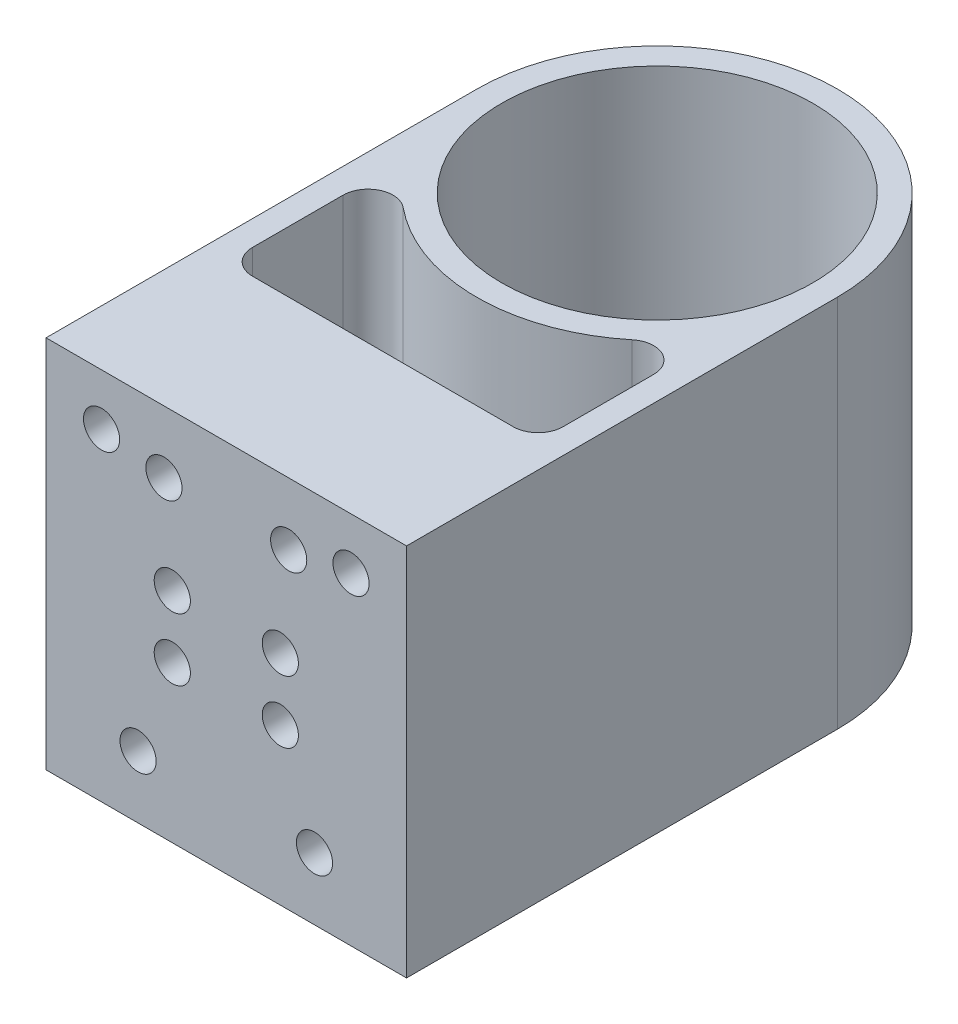
ISO-10303-21;
HEADER;
FILE_DESCRIPTION(('STEP AP214'),'2;1');
FILE_NAME('part.step','',(''),(''),'','','');
FILE_SCHEMA(('AUTOMOTIVE_DESIGN { 1 0 10303 214 1 1 1 1 }'));
ENDSEC;
DATA;
#1=APPLICATION_CONTEXT('core data for automotive mechanical design processes');
#2=APPLICATION_PROTOCOL_DEFINITION('international standard','automotive_design',2000,#1);
#3=PRODUCT_CONTEXT('',#1,'mechanical');
#4=PRODUCT('Part','Part','',(#3));
#5=PRODUCT_RELATED_PRODUCT_CATEGORY('part','',(#4));
#6=PRODUCT_DEFINITION_FORMATION('','',#4);
#7=PRODUCT_DEFINITION_CONTEXT('part definition',#1,'design');
#8=PRODUCT_DEFINITION('design','',#6,#7);
#9=PRODUCT_DEFINITION_SHAPE('','',#8);
#10=(LENGTH_UNIT() NAMED_UNIT(*) SI_UNIT(.MILLI.,.METRE.));
#11=(NAMED_UNIT(*) PLANE_ANGLE_UNIT() SI_UNIT($,.RADIAN.));
#12=(NAMED_UNIT(*) SI_UNIT($,.STERADIAN.) SOLID_ANGLE_UNIT());
#13=UNCERTAINTY_MEASURE_WITH_UNIT(LENGTH_MEASURE(1.E-05),#10,'distance_accuracy_value','');
#14=(GEOMETRIC_REPRESENTATION_CONTEXT(3) GLOBAL_UNCERTAINTY_ASSIGNED_CONTEXT((#13)) GLOBAL_UNIT_ASSIGNED_CONTEXT((#10,
#11,#12)) REPRESENTATION_CONTEXT('',''));
#15=CARTESIAN_POINT('',(0.,0.,0.));
#16=DIRECTION('',(0.,0.,1.));
#17=DIRECTION('',(1.,0.,0.));
#18=AXIS2_PLACEMENT_3D('',#15,#16,#17);
#19=CARTESIAN_POINT('',(0.,30.,0.));
#20=DIRECTION('',(0.,-1.,0.));
#21=DIRECTION('',(0.,0.,-1.));
#22=AXIS2_PLACEMENT_3D('',#19,#20,#21);
#23=CYLINDRICAL_SURFACE('',#22,14.45);
#24=DIRECTION('',(0.,-1.,0.));
#25=VECTOR('',#24,1.);
#26=CARTESIAN_POINT('',(-14.45,30.,0.));
#27=LINE('',#26,#25);
#28=CARTESIAN_POINT('',(-14.45,30.,0.));
#29=VERTEX_POINT('',#28);
#30=CARTESIAN_POINT('',(-14.45,0.,0.));
#31=VERTEX_POINT('',#30);
#32=EDGE_CURVE('E320',#29,#31,#27,.T.);
#33=ORIENTED_EDGE('',*,*,#32,.F.);
#34=CARTESIAN_POINT('',(0.,30.,0.));
#35=DIRECTION('',(0.,1.,0.));
#36=DIRECTION('',(0.,0.,1.));
#37=AXIS2_PLACEMENT_3D('',#34,#35,#36);
#38=CIRCLE('',#37,14.45);
#39=CARTESIAN_POINT('',(14.45,30.,0.));
#40=VERTEX_POINT('',#39);
#41=EDGE_CURVE('E330',#40,#29,#38,.T.);
#42=ORIENTED_EDGE('',*,*,#41,.F.);
#43=DIRECTION('',(0.,-1.,0.));
#44=VECTOR('',#43,1.);
#45=CARTESIAN_POINT('',(14.45,30.,0.));
#46=LINE('',#45,#44);
#47=CARTESIAN_POINT('',(14.45,0.,0.));
#48=VERTEX_POINT('',#47);
#49=EDGE_CURVE('E326',#40,#48,#46,.T.);
#50=ORIENTED_EDGE('',*,*,#49,.T.);
#51=CARTESIAN_POINT('',(0.,0.,0.));
#52=DIRECTION('',(0.,1.,0.));
#53=DIRECTION('',(0.,0.,1.));
#54=AXIS2_PLACEMENT_3D('',#51,#52,#53);
#55=CIRCLE('',#54,14.45);
#56=EDGE_CURVE('E329',#48,#31,#55,.T.);
#57=ORIENTED_EDGE('',*,*,#56,.T.);
#58=EDGE_LOOP('',(#33,#42,#50,#57));
#59=FACE_BOUND('',#58,.T.);
#60=ADVANCED_FACE('F39',(#59),#23,.T.);
#61=CARTESIAN_POINT('',(0.,30.,0.));
#62=DIRECTION('',(0.,1.,0.));
#63=DIRECTION('',(0.,0.,1.));
#64=AXIS2_PLACEMENT_3D('',#61,#62,#63);
#65=PLANE('',#64);
#66=CARTESIAN_POINT('',(-10.45,30.,20.));
#67=DIRECTION('',(0.,1.,0.));
#68=DIRECTION('',(0.,0.,-1.));
#69=AXIS2_PLACEMENT_3D('',#66,#67,#68);
#70=CIRCLE('',#69,2.);
#71=CARTESIAN_POINT('',(-12.45,30.,20.));
#72=VERTEX_POINT('',#71);
#73=CARTESIAN_POINT('',(-10.45,30.,22.));
#74=VERTEX_POINT('',#73);
#75=EDGE_CURVE('E59',#72,#74,#70,.T.);
#76=ORIENTED_EDGE('',*,*,#75,.F.);
#77=DIRECTION('',(0.,0.,1.));
#78=VECTOR('',#77,1.);
#79=CARTESIAN_POINT('',(-12.45,30.,12.7366842231407));
#80=LINE('',#79,#78);
#81=CARTESIAN_POINT('',(-12.45,30.,12.7366842231407));
#82=VERTEX_POINT('',#81);
#83=EDGE_CURVE('E170',#82,#72,#80,.T.);
#84=ORIENTED_EDGE('',*,*,#83,.F.);
#85=CARTESIAN_POINT('',(-10.45,30.,12.7366842231407));
#86=DIRECTION('',(0.,1.,0.));
#87=DIRECTION('',(0.,0.,1.));
#88=AXIS2_PLACEMENT_3D('',#85,#86,#87);
#89=CIRCLE('',#88,2.);
#90=CARTESIAN_POINT('',(-9.18141122913506,30.,11.1905010094058));
#91=VERTEX_POINT('',#90);
#92=EDGE_CURVE('E173',#91,#82,#89,.T.);
#93=ORIENTED_EDGE('',*,*,#92,.F.);
#94=CARTESIAN_POINT('',(0.,30.,0.));
#95=DIRECTION('',(0.,-1.,0.));
#96=DIRECTION('',(0.,0.,1.));
#97=AXIS2_PLACEMENT_3D('',#94,#95,#96);
#98=CIRCLE('',#97,14.475);
#99=CARTESIAN_POINT('',(9.18141122913505,30.,11.1905010094058));
#100=VERTEX_POINT('',#99);
#101=EDGE_CURVE('E202',#100,#91,#98,.T.);
#102=ORIENTED_EDGE('',*,*,#101,.F.);
#103=CARTESIAN_POINT('',(10.45,30.,12.7366842231407));
#104=DIRECTION('',(0.,1.,0.));
#105=DIRECTION('',(0.,0.,-1.));
#106=AXIS2_PLACEMENT_3D('',#103,#104,#105);
#107=CIRCLE('',#106,2.);
#108=CARTESIAN_POINT('',(12.45,30.,12.7366842231407));
#109=VERTEX_POINT('',#108);
#110=EDGE_CURVE('E199',#109,#100,#107,.T.);
#111=ORIENTED_EDGE('',*,*,#110,.F.);
#112=DIRECTION('',(0.,0.,-1.));
#113=VECTOR('',#112,1.);
#114=CARTESIAN_POINT('',(12.45,30.,20.));
#115=LINE('',#114,#113);
#116=CARTESIAN_POINT('',(12.45,30.,20.));
#117=VERTEX_POINT('',#116);
#118=EDGE_CURVE('E196',#117,#109,#115,.T.);
#119=ORIENTED_EDGE('',*,*,#118,.F.);
#120=CARTESIAN_POINT('',(10.45,30.,20.));
#121=DIRECTION('',(0.,1.,0.));
#122=DIRECTION('',(0.,0.,1.));
#123=AXIS2_PLACEMENT_3D('',#120,#121,#122);
#124=CIRCLE('',#123,2.);
#125=CARTESIAN_POINT('',(10.45,30.,22.));
#126=VERTEX_POINT('',#125);
#127=EDGE_CURVE('E193',#126,#117,#124,.T.);
#128=ORIENTED_EDGE('',*,*,#127,.F.);
#129=DIRECTION('',(1.,0.,0.));
#130=VECTOR('',#129,1.);
#131=CARTESIAN_POINT('',(-10.45,30.,22.));
#132=LINE('',#131,#130);
#133=EDGE_CURVE('E190',#74,#126,#132,.T.);
#134=ORIENTED_EDGE('',*,*,#133,.F.);
#135=EDGE_LOOP('',(#76,#84,#93,#102,#111,#119,#128,#134));
#136=FACE_BOUND('',#135,.T.);
#137=CARTESIAN_POINT('',(0.,30.,0.));
#138=DIRECTION('',(0.,1.,0.));
#139=DIRECTION('',(0.,0.,1.));
#140=AXIS2_PLACEMENT_3D('',#137,#138,#139);
#141=CIRCLE('',#140,12.475);
#142=CARTESIAN_POINT('',(0.,30.,12.475));
#143=VERTEX_POINT('',#142);
#144=EDGE_CURVE('E307',#143,#143,#141,.T.);
#145=ORIENTED_EDGE('',*,*,#144,.F.);
#146=EDGE_LOOP('',(#145));
#147=FACE_BOUND('',#146,.T.);
#148=ORIENTED_EDGE('',*,*,#41,.T.);
#149=DIRECTION('',(0.,0.,1.));
#150=VECTOR('',#149,1.);
#151=CARTESIAN_POINT('',(-14.45,30.,0.));
#152=LINE('',#151,#150);
#153=CARTESIAN_POINT('',(-14.45,30.,34.55));
#154=VERTEX_POINT('',#153);
#155=EDGE_CURVE('E314',#29,#154,#152,.T.);
#156=ORIENTED_EDGE('',*,*,#155,.T.);
#157=DIRECTION('',(-1.,0.,0.));
#158=VECTOR('',#157,1.);
#159=CARTESIAN_POINT('',(14.45,30.,34.55));
#160=LINE('',#159,#158);
#161=CARTESIAN_POINT('',(14.45,30.,34.55));
#162=VERTEX_POINT('',#161);
#163=EDGE_CURVE('E286',#162,#154,#160,.T.);
#164=ORIENTED_EDGE('',*,*,#163,.F.);
#165=DIRECTION('',(0.,0.,-1.));
#166=VECTOR('',#165,1.);
#167=CARTESIAN_POINT('',(14.45,30.,0.));
#168=LINE('',#167,#166);
#169=EDGE_CURVE('E316',#162,#40,#168,.T.);
#170=ORIENTED_EDGE('',*,*,#169,.T.);
#171=EDGE_LOOP('',(#148,#156,#164,#170));
#172=FACE_BOUND('',#171,.T.);
#173=ADVANCED_FACE('F383',(#136,#147,#172),#65,.T.);
#174=CARTESIAN_POINT('',(0.,0.,0.));
#175=DIRECTION('',(0.,1.,0.));
#176=DIRECTION('',(0.,0.,1.));
#177=AXIS2_PLACEMENT_3D('',#174,#175,#176);
#178=PLANE('',#177);
#179=DIRECTION('',(0.,0.,1.));
#180=VECTOR('',#179,1.);
#181=CARTESIAN_POINT('',(-12.45,0.,12.7366842231407));
#182=LINE('',#181,#180);
#183=CARTESIAN_POINT('',(-12.45,0.,12.7366842231407));
#184=VERTEX_POINT('',#183);
#185=CARTESIAN_POINT('',(-12.45,0.,20.));
#186=VERTEX_POINT('',#185);
#187=EDGE_CURVE('E169',#184,#186,#182,.T.);
#188=ORIENTED_EDGE('',*,*,#187,.T.);
#189=CARTESIAN_POINT('',(-10.45,0.,20.));
#190=DIRECTION('',(0.,1.,0.));
#191=DIRECTION('',(0.,0.,-1.));
#192=AXIS2_PLACEMENT_3D('',#189,#190,#191);
#193=CIRCLE('',#192,2.);
#194=CARTESIAN_POINT('',(-10.45,0.,22.));
#195=VERTEX_POINT('',#194);
#196=EDGE_CURVE('E150',#186,#195,#193,.T.);
#197=ORIENTED_EDGE('',*,*,#196,.T.);
#198=DIRECTION('',(1.,0.,0.));
#199=VECTOR('',#198,1.);
#200=CARTESIAN_POINT('',(-10.45,0.,22.));
#201=LINE('',#200,#199);
#202=CARTESIAN_POINT('',(10.45,0.,22.));
#203=VERTEX_POINT('',#202);
#204=EDGE_CURVE('E159',#195,#203,#201,.T.);
#205=ORIENTED_EDGE('',*,*,#204,.T.);
#206=CARTESIAN_POINT('',(10.45,0.,20.));
#207=DIRECTION('',(0.,1.,0.));
#208=DIRECTION('',(0.,0.,1.));
#209=AXIS2_PLACEMENT_3D('',#206,#207,#208);
#210=CIRCLE('',#209,2.);
#211=CARTESIAN_POINT('',(12.45,0.,20.));
#212=VERTEX_POINT('',#211);
#213=EDGE_CURVE('E67',#203,#212,#210,.T.);
#214=ORIENTED_EDGE('',*,*,#213,.T.);
#215=DIRECTION('',(0.,0.,-1.));
#216=VECTOR('',#215,1.);
#217=CARTESIAN_POINT('',(12.45,0.,20.));
#218=LINE('',#217,#216);
#219=CARTESIAN_POINT('',(12.45,0.,12.7366842231407));
#220=VERTEX_POINT('',#219);
#221=EDGE_CURVE('E177',#212,#220,#218,.T.);
#222=ORIENTED_EDGE('',*,*,#221,.T.);
#223=CARTESIAN_POINT('',(10.45,0.,12.7366842231407));
#224=DIRECTION('',(0.,1.,0.));
#225=DIRECTION('',(0.,0.,-1.));
#226=AXIS2_PLACEMENT_3D('',#223,#224,#225);
#227=CIRCLE('',#226,2.);
#228=CARTESIAN_POINT('',(9.18141122913505,0.,11.1905010094058));
#229=VERTEX_POINT('',#228);
#230=EDGE_CURVE('E180',#220,#229,#227,.T.);
#231=ORIENTED_EDGE('',*,*,#230,.T.);
#232=CARTESIAN_POINT('',(0.,0.,0.));
#233=DIRECTION('',(0.,-1.,0.));
#234=DIRECTION('',(0.,0.,1.));
#235=AXIS2_PLACEMENT_3D('',#232,#233,#234);
#236=CIRCLE('',#235,14.475);
#237=CARTESIAN_POINT('',(-9.18141122913506,0.,11.1905010094058));
#238=VERTEX_POINT('',#237);
#239=EDGE_CURVE('E183',#229,#238,#236,.T.);
#240=ORIENTED_EDGE('',*,*,#239,.T.);
#241=CARTESIAN_POINT('',(-10.45,0.,12.7366842231407));
#242=DIRECTION('',(0.,1.,0.));
#243=DIRECTION('',(0.,0.,1.));
#244=AXIS2_PLACEMENT_3D('',#241,#242,#243);
#245=CIRCLE('',#244,2.);
#246=EDGE_CURVE('E186',#238,#184,#245,.T.);
#247=ORIENTED_EDGE('',*,*,#246,.T.);
#248=EDGE_LOOP('',(#188,#197,#205,#214,#222,#231,#240,#247));
#249=FACE_BOUND('',#248,.T.);
#250=CARTESIAN_POINT('',(0.,0.,0.));
#251=DIRECTION('',(0.,-1.,0.));
#252=DIRECTION('',(0.,0.,-1.));
#253=AXIS2_PLACEMENT_3D('',#250,#251,#252);
#254=CIRCLE('',#253,3.65);
#255=CARTESIAN_POINT('',(0.,0.,-3.65));
#256=VERTEX_POINT('',#255);
#257=EDGE_CURVE('E289',#256,#256,#254,.T.);
#258=ORIENTED_EDGE('',*,*,#257,.F.);
#259=EDGE_LOOP('',(#258));
#260=FACE_BOUND('',#259,.T.);
#261=CARTESIAN_POINT('',(8.65,0.,0.));
#262=DIRECTION('',(0.,1.,0.));
#263=DIRECTION('',(0.,0.,1.));
#264=AXIS2_PLACEMENT_3D('',#261,#262,#263);
#265=CIRCLE('',#264,1.5);
#266=CARTESIAN_POINT('',(8.65,0.,1.5));
#267=VERTEX_POINT('',#266);
#268=EDGE_CURVE('E304',#267,#267,#265,.T.);
#269=ORIENTED_EDGE('',*,*,#268,.T.);
#270=EDGE_LOOP('',(#269));
#271=FACE_BOUND('',#270,.T.);
#272=CARTESIAN_POINT('',(-8.65,0.,0.));
#273=DIRECTION('',(0.,1.,0.));
#274=DIRECTION('',(0.,0.,1.));
#275=AXIS2_PLACEMENT_3D('',#272,#273,#274);
#276=CIRCLE('',#275,1.5);
#277=CARTESIAN_POINT('',(-8.65,0.,1.5));
#278=VERTEX_POINT('',#277);
#279=EDGE_CURVE('E299',#278,#278,#276,.T.);
#280=ORIENTED_EDGE('',*,*,#279,.T.);
#281=EDGE_LOOP('',(#280));
#282=FACE_BOUND('',#281,.T.);
#283=ORIENTED_EDGE('',*,*,#56,.F.);
#284=DIRECTION('',(0.,0.,-1.));
#285=VECTOR('',#284,1.);
#286=CARTESIAN_POINT('',(14.45,0.,0.));
#287=LINE('',#286,#285);
#288=CARTESIAN_POINT('',(14.45,0.,34.55));
#289=VERTEX_POINT('',#288);
#290=EDGE_CURVE('E317',#289,#48,#287,.T.);
#291=ORIENTED_EDGE('',*,*,#290,.F.);
#292=DIRECTION('',(1.,0.,0.));
#293=VECTOR('',#292,1.);
#294=CARTESIAN_POINT('',(-14.45,0.,34.55));
#295=LINE('',#294,#293);
#296=CARTESIAN_POINT('',(-14.45,0.,34.55));
#297=VERTEX_POINT('',#296);
#298=EDGE_CURVE('E280',#297,#289,#295,.T.);
#299=ORIENTED_EDGE('',*,*,#298,.F.);
#300=DIRECTION('',(0.,0.,1.));
#301=VECTOR('',#300,1.);
#302=CARTESIAN_POINT('',(-14.45,0.,0.));
#303=LINE('',#302,#301);
#304=EDGE_CURVE('E311',#31,#297,#303,.T.);
#305=ORIENTED_EDGE('',*,*,#304,.F.);
#306=EDGE_LOOP('',(#283,#291,#299,#305));
#307=FACE_BOUND('',#306,.T.);
#308=ADVANCED_FACE('F165',(#249,#260,#271,#282,#307),#178,.F.);
#309=CARTESIAN_POINT('',(-14.45,30.,0.));
#310=DIRECTION('',(1.,0.,0.));
#311=DIRECTION('',(0.,0.,-1.));
#312=AXIS2_PLACEMENT_3D('',#309,#310,#311);
#313=PLANE('',#312);
#314=ORIENTED_EDGE('',*,*,#304,.T.);
#315=DIRECTION('',(0.,-1.,0.));
#316=VECTOR('',#315,1.);
#317=CARTESIAN_POINT('',(-14.45,30.,34.55));
#318=LINE('',#317,#316);
#319=EDGE_CURVE('E277',#154,#297,#318,.T.);
#320=ORIENTED_EDGE('',*,*,#319,.F.);
#321=ORIENTED_EDGE('',*,*,#155,.F.);
#322=ORIENTED_EDGE('',*,*,#32,.T.);
#323=EDGE_LOOP('',(#314,#320,#321,#322));
#324=FACE_BOUND('',#323,.T.);
#325=ADVANCED_FACE('F398',(#324),#313,.F.);
#326=CARTESIAN_POINT('',(14.45,30.,0.));
#327=DIRECTION('',(-1.,0.,0.));
#328=DIRECTION('',(0.,0.,1.));
#329=AXIS2_PLACEMENT_3D('',#326,#327,#328);
#330=PLANE('',#329);
#331=ORIENTED_EDGE('',*,*,#290,.T.);
#332=ORIENTED_EDGE('',*,*,#49,.F.);
#333=ORIENTED_EDGE('',*,*,#169,.F.);
#334=DIRECTION('',(0.,1.,0.));
#335=VECTOR('',#334,1.);
#336=CARTESIAN_POINT('',(14.45,0.,34.55));
#337=LINE('',#336,#335);
#338=EDGE_CURVE('E283',#289,#162,#337,.T.);
#339=ORIENTED_EDGE('',*,*,#338,.F.);
#340=EDGE_LOOP('',(#331,#332,#333,#339));
#341=FACE_BOUND('',#340,.T.);
#342=ADVANCED_FACE('F404',(#341),#330,.F.);
#343=CARTESIAN_POINT('',(0.,2.,0.));
#344=DIRECTION('',(0.,1.,0.));
#345=DIRECTION('',(0.,0.,1.));
#346=AXIS2_PLACEMENT_3D('',#343,#344,#345);
#347=CYLINDRICAL_SURFACE('',#346,12.475);
#348=CARTESIAN_POINT('',(0.,2.,0.));
#349=DIRECTION('',(0.,1.,0.));
#350=DIRECTION('',(0.,0.,1.));
#351=AXIS2_PLACEMENT_3D('',#348,#349,#350);
#352=CIRCLE('',#351,12.475);
#353=CARTESIAN_POINT('',(0.,2.,12.475));
#354=VERTEX_POINT('',#353);
#355=EDGE_CURVE('E308',#354,#354,#352,.T.);
#356=ORIENTED_EDGE('',*,*,#355,.F.);
#357=EDGE_LOOP('',(#356));
#358=FACE_BOUND('',#357,.T.);
#359=ORIENTED_EDGE('',*,*,#144,.T.);
#360=EDGE_LOOP('',(#359));
#361=FACE_BOUND('',#360,.T.);
#362=ADVANCED_FACE('F415',(#358,#361),#347,.F.);
#363=CARTESIAN_POINT('',(0.,2.,0.));
#364=DIRECTION('',(0.,1.,0.));
#365=DIRECTION('',(0.,0.,1.));
#366=AXIS2_PLACEMENT_3D('',#363,#364,#365);
#367=PLANE('',#366);
#368=CARTESIAN_POINT('',(0.,2.,0.));
#369=DIRECTION('',(0.,-1.,0.));
#370=DIRECTION('',(0.,0.,-1.));
#371=AXIS2_PLACEMENT_3D('',#368,#369,#370);
#372=CIRCLE('',#371,3.65);
#373=CARTESIAN_POINT('',(0.,2.,-3.65));
#374=VERTEX_POINT('',#373);
#375=EDGE_CURVE('E290',#374,#374,#372,.T.);
#376=ORIENTED_EDGE('',*,*,#375,.T.);
#377=EDGE_LOOP('',(#376));
#378=FACE_BOUND('',#377,.T.);
#379=CARTESIAN_POINT('',(8.65,2.,0.));
#380=DIRECTION('',(0.,1.,0.));
#381=DIRECTION('',(0.,0.,1.));
#382=AXIS2_PLACEMENT_3D('',#379,#380,#381);
#383=CIRCLE('',#382,1.5);
#384=CARTESIAN_POINT('',(8.65,2.,1.5));
#385=VERTEX_POINT('',#384);
#386=EDGE_CURVE('E296',#385,#385,#383,.T.);
#387=ORIENTED_EDGE('',*,*,#386,.F.);
#388=EDGE_LOOP('',(#387));
#389=FACE_BOUND('',#388,.T.);
#390=CARTESIAN_POINT('',(-8.65,2.,0.));
#391=DIRECTION('',(0.,1.,0.));
#392=DIRECTION('',(0.,0.,-1.));
#393=AXIS2_PLACEMENT_3D('',#390,#391,#392);
#394=CIRCLE('',#393,1.5);
#395=CARTESIAN_POINT('',(-8.65,2.,-1.5));
#396=VERTEX_POINT('',#395);
#397=EDGE_CURVE('E293',#396,#396,#394,.T.);
#398=ORIENTED_EDGE('',*,*,#397,.F.);
#399=EDGE_LOOP('',(#398));
#400=FACE_BOUND('',#399,.T.);
#401=ORIENTED_EDGE('',*,*,#355,.T.);
#402=EDGE_LOOP('',(#401));
#403=FACE_BOUND('',#402,.T.);
#404=ADVANCED_FACE('F417',(#378,#389,#400,#403),#367,.T.);
#405=CARTESIAN_POINT('',(-8.65,-26.,0.));
#406=DIRECTION('',(0.,1.,0.));
#407=DIRECTION('',(0.,0.,1.));
#408=AXIS2_PLACEMENT_3D('',#405,#406,#407);
#409=CYLINDRICAL_SURFACE('',#408,1.5);
#410=ORIENTED_EDGE('',*,*,#397,.T.);
#411=EDGE_LOOP('',(#410));
#412=FACE_BOUND('',#411,.T.);
#413=ORIENTED_EDGE('',*,*,#279,.F.);
#414=EDGE_LOOP('',(#413));
#415=FACE_BOUND('',#414,.T.);
#416=ADVANCED_FACE('F421',(#412,#415),#409,.F.);
#417=CARTESIAN_POINT('',(8.65,-26.,0.));
#418=DIRECTION('',(0.,1.,0.));
#419=DIRECTION('',(0.,0.,1.));
#420=AXIS2_PLACEMENT_3D('',#417,#418,#419);
#421=CYLINDRICAL_SURFACE('',#420,1.5);
#422=ORIENTED_EDGE('',*,*,#386,.T.);
#423=EDGE_LOOP('',(#422));
#424=FACE_BOUND('',#423,.T.);
#425=ORIENTED_EDGE('',*,*,#268,.F.);
#426=EDGE_LOOP('',(#425));
#427=FACE_BOUND('',#426,.T.);
#428=ADVANCED_FACE('F358',(#424,#427),#421,.F.);
#429=CARTESIAN_POINT('',(0.,2.,0.));
#430=DIRECTION('',(0.,-1.,0.));
#431=DIRECTION('',(0.,0.,-1.));
#432=AXIS2_PLACEMENT_3D('',#429,#430,#431);
#433=CYLINDRICAL_SURFACE('',#432,3.65);
#434=ORIENTED_EDGE('',*,*,#375,.F.);
#435=EDGE_LOOP('',(#434));
#436=FACE_BOUND('',#435,.T.);
#437=ORIENTED_EDGE('',*,*,#257,.T.);
#438=EDGE_LOOP('',(#437));
#439=FACE_BOUND('',#438,.T.);
#440=ADVANCED_FACE('F354',(#436,#439),#433,.F.);
#441=CARTESIAN_POINT('',(0.,0.,34.55));
#442=DIRECTION('',(0.,0.,1.));
#443=DIRECTION('',(1.,0.,0.));
#444=AXIS2_PLACEMENT_3D('',#441,#442,#443);
#445=PLANE('',#444);
#446=CARTESIAN_POINT('',(-4.33012701892217,12.5,34.55));
#447=DIRECTION('',(0.,0.,1.));
#448=DIRECTION('',(1.,0.,0.));
#449=AXIS2_PLACEMENT_3D('',#446,#447,#448);
#450=CIRCLE('',#449,1.45);
#451=CARTESIAN_POINT('',(-2.88012701892217,12.5,34.55));
#452=VERTEX_POINT('',#451);
#453=EDGE_CURVE('E250',#452,#452,#450,.T.);
#454=ORIENTED_EDGE('',*,*,#453,.F.);
#455=EDGE_LOOP('',(#454));
#456=FACE_BOUND('',#455,.T.);
#457=CARTESIAN_POINT('',(-5.,25.,34.55));
#458=DIRECTION('',(0.,0.,1.));
#459=DIRECTION('',(1.,0.,0.));
#460=AXIS2_PLACEMENT_3D('',#457,#458,#459);
#461=CIRCLE('',#460,1.45);
#462=CARTESIAN_POINT('',(-3.55,25.,34.55));
#463=VERTEX_POINT('',#462);
#464=EDGE_CURVE('E256',#463,#463,#461,.T.);
#465=ORIENTED_EDGE('',*,*,#464,.F.);
#466=EDGE_LOOP('',(#465));
#467=FACE_BOUND('',#466,.T.);
#468=CARTESIAN_POINT('',(-10.,25.88,34.55));
#469=DIRECTION('',(0.,0.,1.));
#470=DIRECTION('',(1.,0.,0.));
#471=AXIS2_PLACEMENT_3D('',#468,#469,#470);
#472=CIRCLE('',#471,1.45);
#473=CARTESIAN_POINT('',(-8.55,25.88,34.55));
#474=VERTEX_POINT('',#473);
#475=EDGE_CURVE('E262',#474,#474,#472,.T.);
#476=ORIENTED_EDGE('',*,*,#475,.F.);
#477=EDGE_LOOP('',(#476));
#478=FACE_BOUND('',#477,.T.);
#479=CARTESIAN_POINT('',(-4.33012701892219,17.5,34.55));
#480=DIRECTION('',(0.,0.,1.));
#481=DIRECTION('',(1.,0.,0.));
#482=AXIS2_PLACEMENT_3D('',#479,#480,#481);
#483=CIRCLE('',#482,1.45);
#484=CARTESIAN_POINT('',(-2.88012701892219,17.5,34.55));
#485=VERTEX_POINT('',#484);
#486=EDGE_CURVE('E268',#485,#485,#483,.T.);
#487=ORIENTED_EDGE('',*,*,#486,.F.);
#488=EDGE_LOOP('',(#487));
#489=FACE_BOUND('',#488,.T.);
#490=CARTESIAN_POINT('',(-7.0711,5.,34.55));
#491=DIRECTION('',(0.,0.,1.));
#492=DIRECTION('',(1.,0.,0.));
#493=AXIS2_PLACEMENT_3D('',#490,#491,#492);
#494=CIRCLE('',#493,1.45);
#495=CARTESIAN_POINT('',(-5.6211,5.,34.55));
#496=VERTEX_POINT('',#495);
#497=EDGE_CURVE('E274',#496,#496,#494,.T.);
#498=ORIENTED_EDGE('',*,*,#497,.F.);
#499=EDGE_LOOP('',(#498));
#500=FACE_BOUND('',#499,.T.);
#501=ORIENTED_EDGE('',*,*,#319,.T.);
#502=ORIENTED_EDGE('',*,*,#298,.T.);
#503=ORIENTED_EDGE('',*,*,#338,.T.);
#504=ORIENTED_EDGE('',*,*,#163,.T.);
#505=EDGE_LOOP('',(#501,#502,#503,#504));
#506=FACE_BOUND('',#505,.T.);
#507=CARTESIAN_POINT('',(7.0711,5.,34.55));
#508=DIRECTION('',(0.,0.,1.));
#509=DIRECTION('',(1.,0.,0.));
#510=AXIS2_PLACEMENT_3D('',#507,#508,#509);
#511=CIRCLE('',#510,1.45);
#512=CARTESIAN_POINT('',(8.5211,5.,34.55));
#513=VERTEX_POINT('',#512);
#514=EDGE_CURVE('E271',#513,#513,#511,.T.);
#515=ORIENTED_EDGE('',*,*,#514,.F.);
#516=EDGE_LOOP('',(#515));
#517=FACE_BOUND('',#516,.T.);
#518=CARTESIAN_POINT('',(4.33012701892217,12.5,34.55));
#519=DIRECTION('',(0.,0.,1.));
#520=DIRECTION('',(1.,0.,0.));
#521=AXIS2_PLACEMENT_3D('',#518,#519,#520);
#522=CIRCLE('',#521,1.45);
#523=CARTESIAN_POINT('',(5.78012701892218,12.5,34.55));
#524=VERTEX_POINT('',#523);
#525=EDGE_CURVE('E265',#524,#524,#522,.T.);
#526=ORIENTED_EDGE('',*,*,#525,.F.);
#527=EDGE_LOOP('',(#526));
#528=FACE_BOUND('',#527,.T.);
#529=CARTESIAN_POINT('',(10.,25.88,34.55));
#530=DIRECTION('',(0.,0.,1.));
#531=DIRECTION('',(1.,0.,0.));
#532=AXIS2_PLACEMENT_3D('',#529,#530,#531);
#533=CIRCLE('',#532,1.45);
#534=CARTESIAN_POINT('',(11.45,25.88,34.55));
#535=VERTEX_POINT('',#534);
#536=EDGE_CURVE('E259',#535,#535,#533,.T.);
#537=ORIENTED_EDGE('',*,*,#536,.F.);
#538=EDGE_LOOP('',(#537));
#539=FACE_BOUND('',#538,.T.);
#540=CARTESIAN_POINT('',(5.,25.,34.55));
#541=DIRECTION('',(0.,0.,1.));
#542=DIRECTION('',(1.,0.,0.));
#543=AXIS2_PLACEMENT_3D('',#540,#541,#542);
#544=CIRCLE('',#543,1.45);
#545=CARTESIAN_POINT('',(6.45,25.,34.55));
#546=VERTEX_POINT('',#545);
#547=EDGE_CURVE('E253',#546,#546,#544,.T.);
#548=ORIENTED_EDGE('',*,*,#547,.F.);
#549=EDGE_LOOP('',(#548));
#550=FACE_BOUND('',#549,.T.);
#551=CARTESIAN_POINT('',(4.33012701892219,17.5,34.55));
#552=DIRECTION('',(0.,0.,1.));
#553=DIRECTION('',(1.,0.,0.));
#554=AXIS2_PLACEMENT_3D('',#551,#552,#553);
#555=CIRCLE('',#554,1.45);
#556=CARTESIAN_POINT('',(5.78012701892219,17.5,34.55));
#557=VERTEX_POINT('',#556);
#558=EDGE_CURVE('E247',#557,#557,#555,.T.);
#559=ORIENTED_EDGE('',*,*,#558,.F.);
#560=EDGE_LOOP('',(#559));
#561=FACE_BOUND('',#560,.T.);
#562=ADVANCED_FACE('F350',(#456,#467,#478,#489,#500,#506,#517,#528,#539,#550,#561),#445,.T.);
#563=CARTESIAN_POINT('',(-5.,25.,15.45));
#564=DIRECTION('',(0.,0.,1.));
#565=DIRECTION('',(1.,0.,0.));
#566=AXIS2_PLACEMENT_3D('',#563,#564,#565);
#567=CYLINDRICAL_SURFACE('',#566,1.45);
#568=CARTESIAN_POINT('',(-5.,25.,22.));
#569=DIRECTION('',(0.,0.,1.));
#570=DIRECTION('',(1.,0.,0.));
#571=AXIS2_PLACEMENT_3D('',#568,#569,#570);
#572=CIRCLE('',#571,1.45);
#573=CARTESIAN_POINT('',(-3.55,25.,22.));
#574=VERTEX_POINT('',#573);
#575=EDGE_CURVE('E244',#574,#574,#572,.F.);
#576=ORIENTED_EDGE('',*,*,#575,.T.);
#577=EDGE_LOOP('',(#576));
#578=FACE_BOUND('',#577,.T.);
#579=ORIENTED_EDGE('',*,*,#464,.T.);
#580=EDGE_LOOP('',(#579));
#581=FACE_BOUND('',#580,.T.);
#582=ADVANCED_FACE('F353',(#578,#581),#567,.F.);
#583=CARTESIAN_POINT('',(4.33012701892219,17.5,15.45));
#584=DIRECTION('',(0.,0.,1.));
#585=DIRECTION('',(1.,0.,0.));
#586=AXIS2_PLACEMENT_3D('',#583,#584,#585);
#587=CYLINDRICAL_SURFACE('',#586,1.45);
#588=CARTESIAN_POINT('',(4.33012701892219,17.5,22.));
#589=DIRECTION('',(0.,0.,1.));
#590=DIRECTION('',(1.,0.,0.));
#591=AXIS2_PLACEMENT_3D('',#588,#589,#590);
#592=CIRCLE('',#591,1.45);
#593=CARTESIAN_POINT('',(5.78012701892219,17.5,22.));
#594=VERTEX_POINT('',#593);
#595=EDGE_CURVE('E241',#594,#594,#592,.F.);
#596=ORIENTED_EDGE('',*,*,#595,.T.);
#597=EDGE_LOOP('',(#596));
#598=FACE_BOUND('',#597,.T.);
#599=ORIENTED_EDGE('',*,*,#558,.T.);
#600=EDGE_LOOP('',(#599));
#601=FACE_BOUND('',#600,.T.);
#602=ADVANCED_FACE('F360',(#598,#601),#587,.F.);
#603=CARTESIAN_POINT('',(-4.33012701892219,17.5,15.45));
#604=DIRECTION('',(0.,0.,1.));
#605=DIRECTION('',(1.,0.,0.));
#606=AXIS2_PLACEMENT_3D('',#603,#604,#605);
#607=CYLINDRICAL_SURFACE('',#606,1.45);
#608=CARTESIAN_POINT('',(-4.33012701892219,17.5,22.));
#609=DIRECTION('',(0.,0.,1.));
#610=DIRECTION('',(1.,0.,0.));
#611=AXIS2_PLACEMENT_3D('',#608,#609,#610);
#612=CIRCLE('',#611,1.45);
#613=CARTESIAN_POINT('',(-2.88012701892219,17.5,22.));
#614=VERTEX_POINT('',#613);
#615=EDGE_CURVE('E238',#614,#614,#612,.F.);
#616=ORIENTED_EDGE('',*,*,#615,.T.);
#617=EDGE_LOOP('',(#616));
#618=FACE_BOUND('',#617,.T.);
#619=ORIENTED_EDGE('',*,*,#486,.T.);
#620=EDGE_LOOP('',(#619));
#621=FACE_BOUND('',#620,.T.);
#622=ADVANCED_FACE('F362',(#618,#621),#607,.F.);
#623=CARTESIAN_POINT('',(7.0711,5.,15.45));
#624=DIRECTION('',(0.,0.,1.));
#625=DIRECTION('',(1.,0.,0.));
#626=AXIS2_PLACEMENT_3D('',#623,#624,#625);
#627=CYLINDRICAL_SURFACE('',#626,1.45);
#628=CARTESIAN_POINT('',(7.0711,5.,22.));
#629=DIRECTION('',(0.,0.,1.));
#630=DIRECTION('',(1.,0.,0.));
#631=AXIS2_PLACEMENT_3D('',#628,#629,#630);
#632=CIRCLE('',#631,1.45);
#633=CARTESIAN_POINT('',(8.5211,5.,22.));
#634=VERTEX_POINT('',#633);
#635=EDGE_CURVE('E235',#634,#634,#632,.F.);
#636=ORIENTED_EDGE('',*,*,#635,.T.);
#637=EDGE_LOOP('',(#636));
#638=FACE_BOUND('',#637,.T.);
#639=ORIENTED_EDGE('',*,*,#514,.T.);
#640=EDGE_LOOP('',(#639));
#641=FACE_BOUND('',#640,.T.);
#642=ADVANCED_FACE('F434',(#638,#641),#627,.F.);
#643=CARTESIAN_POINT('',(-7.0711,5.,15.45));
#644=DIRECTION('',(0.,0.,1.));
#645=DIRECTION('',(1.,0.,0.));
#646=AXIS2_PLACEMENT_3D('',#643,#644,#645);
#647=CYLINDRICAL_SURFACE('',#646,1.45);
#648=CARTESIAN_POINT('',(-7.0711,5.,22.));
#649=DIRECTION('',(0.,0.,1.));
#650=DIRECTION('',(1.,0.,0.));
#651=AXIS2_PLACEMENT_3D('',#648,#649,#650);
#652=CIRCLE('',#651,1.45);
#653=CARTESIAN_POINT('',(-5.6211,5.,22.));
#654=VERTEX_POINT('',#653);
#655=EDGE_CURVE('E232',#654,#654,#652,.F.);
#656=ORIENTED_EDGE('',*,*,#655,.T.);
#657=EDGE_LOOP('',(#656));
#658=FACE_BOUND('',#657,.T.);
#659=ORIENTED_EDGE('',*,*,#497,.T.);
#660=EDGE_LOOP('',(#659));
#661=FACE_BOUND('',#660,.T.);
#662=ADVANCED_FACE('F431',(#658,#661),#647,.F.);
#663=CARTESIAN_POINT('',(5.,25.,15.45));
#664=DIRECTION('',(0.,0.,1.));
#665=DIRECTION('',(1.,0.,0.));
#666=AXIS2_PLACEMENT_3D('',#663,#664,#665);
#667=CYLINDRICAL_SURFACE('',#666,1.45);
#668=CARTESIAN_POINT('',(5.,25.,22.));
#669=DIRECTION('',(0.,0.,1.));
#670=DIRECTION('',(1.,0.,0.));
#671=AXIS2_PLACEMENT_3D('',#668,#669,#670);
#672=CIRCLE('',#671,1.45);
#673=CARTESIAN_POINT('',(6.45,25.,22.));
#674=VERTEX_POINT('',#673);
#675=EDGE_CURVE('E229',#674,#674,#672,.F.);
#676=ORIENTED_EDGE('',*,*,#675,.T.);
#677=EDGE_LOOP('',(#676));
#678=FACE_BOUND('',#677,.T.);
#679=ORIENTED_EDGE('',*,*,#547,.T.);
#680=EDGE_LOOP('',(#679));
#681=FACE_BOUND('',#680,.T.);
#682=ADVANCED_FACE('F371',(#678,#681),#667,.F.);
#683=CARTESIAN_POINT('',(-4.33012701892217,12.5,15.45));
#684=DIRECTION('',(0.,0.,1.));
#685=DIRECTION('',(1.,0.,0.));
#686=AXIS2_PLACEMENT_3D('',#683,#684,#685);
#687=CYLINDRICAL_SURFACE('',#686,1.45);
#688=CARTESIAN_POINT('',(-4.33012701892217,12.5,22.));
#689=DIRECTION('',(0.,0.,1.));
#690=DIRECTION('',(1.,0.,0.));
#691=AXIS2_PLACEMENT_3D('',#688,#689,#690);
#692=CIRCLE('',#691,1.45);
#693=CARTESIAN_POINT('',(-2.88012701892217,12.5,22.));
#694=VERTEX_POINT('',#693);
#695=EDGE_CURVE('E226',#694,#694,#692,.F.);
#696=ORIENTED_EDGE('',*,*,#695,.T.);
#697=EDGE_LOOP('',(#696));
#698=FACE_BOUND('',#697,.T.);
#699=ORIENTED_EDGE('',*,*,#453,.T.);
#700=EDGE_LOOP('',(#699));
#701=FACE_BOUND('',#700,.T.);
#702=ADVANCED_FACE('F368',(#698,#701),#687,.F.);
#703=CARTESIAN_POINT('',(10.,25.88,15.45));
#704=DIRECTION('',(0.,0.,1.));
#705=DIRECTION('',(1.,0.,0.));
#706=AXIS2_PLACEMENT_3D('',#703,#704,#705);
#707=CYLINDRICAL_SURFACE('',#706,1.45);
#708=CARTESIAN_POINT('',(10.,25.88,22.));
#709=DIRECTION('',(0.,0.,1.));
#710=DIRECTION('',(1.,0.,0.));
#711=AXIS2_PLACEMENT_3D('',#708,#709,#710);
#712=CIRCLE('',#711,1.45);
#713=CARTESIAN_POINT('',(10.45,24.501595124791,22.));
#714=VERTEX_POINT('',#713);
#715=CARTESIAN_POINT('',(10.45,27.258404875209,22.));
#716=VERTEX_POINT('',#715);
#717=EDGE_CURVE('E223',#714,#716,#712,.F.);
#718=ORIENTED_EDGE('',*,*,#717,.T.);
#719=CARTESIAN_POINT('',(10.45,27.258404875209,22.));
#720=CARTESIAN_POINT('',(10.4864770635092,27.2464998870683,22.0000042036603));
#721=CARTESIAN_POINT('',(10.5224519418631,27.2331488995539,21.9990015306085));
#722=CARTESIAN_POINT('',(10.593121656314,27.2036954273463,21.9951852490778));
#723=CARTESIAN_POINT('',(10.6278176147913,27.1875954286316,21.9923732704802));
#724=CARTESIAN_POINT('',(10.7292033080693,27.1355863845671,21.9815739719408));
#725=CARTESIAN_POINT('',(10.7937001731156,27.0958004194483,21.9712176356426));
#726=CARTESIAN_POINT('',(10.9149418261278,27.0073902418625,21.9461919758594));
#727=CARTESIAN_POINT('',(10.9717098440744,26.9587935859261,21.9315360140458));
#728=CARTESIAN_POINT('',(11.0769458000388,26.8537682458053,21.8999898212951));
#729=CARTESIAN_POINT('',(11.125396840861,26.7973240292924,21.8830951625948));
#730=CARTESIAN_POINT('',(11.2172262506388,26.6721101281445,21.8477034419546));
#731=CARTESIAN_POINT('',(11.2597090709466,26.6026817536535,21.8292039976802));
#732=CARTESIAN_POINT('',(11.3326840206644,26.4571251798893,21.7951311990006));
#733=CARTESIAN_POINT('',(11.3631817869689,26.3810001509016,21.7795564708264));
#734=CARTESIAN_POINT('',(11.4110933334363,26.2236284901586,21.7541516111776));
#735=CARTESIAN_POINT('',(11.4284883133641,26.1423746798405,21.7443297385307));
#736=CARTESIAN_POINT('',(11.4490877038581,25.9775646350747,21.732621952195));
#737=CARTESIAN_POINT('',(11.4523095448511,25.894011355952,21.7307262908256));
#738=CARTESIAN_POINT('',(11.4449030893964,25.7384474551368,21.73498379208));
#739=CARTESIAN_POINT('',(11.435982824858,25.6663193120483,21.7401447313508));
#740=CARTESIAN_POINT('',(11.407664843686,25.5247624691497,21.7558864094522));
#741=CARTESIAN_POINT('',(11.388262420305,25.4553349970316,21.766469582889));
#742=CARTESIAN_POINT('',(11.3393319797333,25.3196623307183,21.7916055552618));
#743=CARTESIAN_POINT('',(11.3096475523121,25.2534854672895,21.806218917369));
#744=CARTESIAN_POINT('',(11.2409933537355,25.1265757739413,21.8373212014267));
#745=CARTESIAN_POINT('',(11.2020153745352,25.0658478221145,21.8538117745599));
#746=CARTESIAN_POINT('',(11.1096986953246,24.9431326740852,21.8887943313097));
#747=CARTESIAN_POINT('',(11.0551399012224,24.8820507238558,21.9072610395051));
#748=CARTESIAN_POINT('',(10.9360659394148,24.7696088526118,21.9410203736388));
#749=CARTESIAN_POINT('',(10.8715688234058,24.718231673416,21.9563186388452));
#750=CARTESIAN_POINT('',(10.7486709251127,24.6365364692438,21.9783332249405));
#751=CARTESIAN_POINT('',(10.6919063958041,24.6040641165256,21.9861842603411));
#752=CARTESIAN_POINT('',(10.5739581715743,24.5468005461081,21.9970485362869));
#753=CARTESIAN_POINT('',(10.5127592547279,24.5220374972682,22.0000441997022));
#754=CARTESIAN_POINT('',(10.45,24.501595124791,22.));
#755=B_SPLINE_CURVE_WITH_KNOTS('',3,(#719,#720,#721,#722,#723,#724,#725,#726,#727,#728,#729,
#730,#731,#732,#733,#734,#735,#736,#737,#738,#739,#740,#741,#742,#743,#744,#745,#746,#747,#748,
#749,#750,#751,#752,#753,#754),.UNSPECIFIED.,.F.,.F.,(4,2,2,2,2,2,2,2,2,2,2,2,2,2,2,2,2,4),(0.,
0.115017488129771,0.229931509554296,0.458174289005083,0.685715153583625,0.913712966716631,
1.16299117127191,1.41215199283726,1.6616696397048,1.91088033853953,2.12842159027956,
2.34606060468106,2.56716736801329,2.78847014048284,3.03918401523403,3.28944775446637,
3.48630474104642,3.68387279862822),.UNSPECIFIED.);
#756=EDGE_CURVE('E11',#716,#714,#755,.T.);
#757=ORIENTED_EDGE('',*,*,#756,.T.);
#758=EDGE_LOOP('',(#718,#757));
#759=FACE_BOUND('',#758,.T.);
#760=ORIENTED_EDGE('',*,*,#536,.T.);
#761=EDGE_LOOP('',(#760));
#762=FACE_BOUND('',#761,.T.);
#763=ADVANCED_FACE('F364',(#759,#762),#707,.F.);
#764=CARTESIAN_POINT('',(-10.,25.88,15.45));
#765=DIRECTION('',(0.,0.,1.));
#766=DIRECTION('',(1.,0.,0.));
#767=AXIS2_PLACEMENT_3D('',#764,#765,#766);
#768=CYLINDRICAL_SURFACE('',#767,1.45);
#769=CARTESIAN_POINT('',(-10.,25.88,22.));
#770=DIRECTION('',(0.,0.,1.));
#771=DIRECTION('',(1.,0.,0.));
#772=AXIS2_PLACEMENT_3D('',#769,#770,#771);
#773=CIRCLE('',#772,1.45);
#774=CARTESIAN_POINT('',(-10.45,27.258404875209,22.));
#775=VERTEX_POINT('',#774);
#776=CARTESIAN_POINT('',(-10.45,24.501595124791,22.));
#777=VERTEX_POINT('',#776);
#778=EDGE_CURVE('E221',#775,#777,#773,.F.);
#779=ORIENTED_EDGE('',*,*,#778,.T.);
#780=CARTESIAN_POINT('',(-10.45,24.501595124791,22.));
#781=CARTESIAN_POINT('',(-10.4864770635092,24.5135001129317,22.0000042036603));
#782=CARTESIAN_POINT('',(-10.5224519418631,24.5268511004461,21.9990015306085));
#783=CARTESIAN_POINT('',(-10.593121656314,24.5563045726537,21.9951852490778));
#784=CARTESIAN_POINT('',(-10.6278176147913,24.5724045713684,21.9923732704802));
#785=CARTESIAN_POINT('',(-10.7292033080693,24.6244136154329,21.9815739719408));
#786=CARTESIAN_POINT('',(-10.7937001731156,24.6641995805517,21.9712176356426));
#787=CARTESIAN_POINT('',(-10.9149418261278,24.7526097581375,21.9461919758594));
#788=CARTESIAN_POINT('',(-10.9717098440744,24.8012064140739,21.9315360140458));
#789=CARTESIAN_POINT('',(-11.0769458000388,24.9062317541947,21.8999898212951));
#790=CARTESIAN_POINT('',(-11.125396840861,24.9626759707077,21.8830951625948));
#791=CARTESIAN_POINT('',(-11.2172262506388,25.0878898718555,21.8477034419546));
#792=CARTESIAN_POINT('',(-11.2597090709466,25.1573182463465,21.8292039976802));
#793=CARTESIAN_POINT('',(-11.3326840206644,25.3028748201107,21.7951311990006));
#794=CARTESIAN_POINT('',(-11.3631817869689,25.3789998490984,21.7795564708264));
#795=CARTESIAN_POINT('',(-11.4110933334363,25.5363715098414,21.7541516111776));
#796=CARTESIAN_POINT('',(-11.4284883133641,25.6176253201595,21.7443297385307));
#797=CARTESIAN_POINT('',(-11.4490877038581,25.7824353649253,21.732621952195));
#798=CARTESIAN_POINT('',(-11.4523095448511,25.865988644048,21.7307262908256));
#799=CARTESIAN_POINT('',(-11.4449030893964,26.0215525448632,21.73498379208));
#800=CARTESIAN_POINT('',(-11.435982824858,26.0936806879517,21.7401447313508));
#801=CARTESIAN_POINT('',(-11.407664843686,26.2352375308503,21.7558864094522));
#802=CARTESIAN_POINT('',(-11.388262420305,26.3046650029684,21.766469582889));
#803=CARTESIAN_POINT('',(-11.3393319797333,26.4403376692817,21.7916055552618));
#804=CARTESIAN_POINT('',(-11.3096475523121,26.5065145327105,21.806218917369));
#805=CARTESIAN_POINT('',(-11.2409933537355,26.6334242260587,21.8373212014267));
#806=CARTESIAN_POINT('',(-11.2020153745352,26.6941521778855,21.8538117745599));
#807=CARTESIAN_POINT('',(-11.1096986953246,26.8168673259148,21.8887943313097));
#808=CARTESIAN_POINT('',(-11.0551399012224,26.8779492761442,21.9072610395051));
#809=CARTESIAN_POINT('',(-10.9360659394148,26.9903911473882,21.9410203736388));
#810=CARTESIAN_POINT('',(-10.8715688234058,27.041768326584,21.9563186388452));
#811=CARTESIAN_POINT('',(-10.7486709251127,27.1234635307562,21.9783332249405));
#812=CARTESIAN_POINT('',(-10.6919063958041,27.1559358834744,21.9861842603411));
#813=CARTESIAN_POINT('',(-10.5739581715743,27.2131994538919,21.9970485362869));
#814=CARTESIAN_POINT('',(-10.5127592547279,27.2379625027318,22.0000441997022));
#815=CARTESIAN_POINT('',(-10.45,27.258404875209,22.));
#816=B_SPLINE_CURVE_WITH_KNOTS('',3,(#780,#781,#782,#783,#784,#785,#786,#787,#788,#789,#790,
#791,#792,#793,#794,#795,#796,#797,#798,#799,#800,#801,#802,#803,#804,#805,#806,#807,#808,#809,
#810,#811,#812,#813,#814,#815),.UNSPECIFIED.,.F.,.F.,(4,2,2,2,2,2,2,2,2,2,2,2,2,2,2,2,2,4),(0.,
0.115017488129773,0.229931509554297,0.458174289005084,0.685715153583623,0.913712966716632,
1.16299117127192,1.41215199283726,1.66166963970481,1.91088033853953,2.12842159027956,
2.34606060468107,2.56716736801329,2.78847014048284,3.03918401523404,3.28944775446637,
3.48630474104642,3.68387279862822),.UNSPECIFIED.);
#817=EDGE_CURVE('E52',#777,#775,#816,.T.);
#818=ORIENTED_EDGE('',*,*,#817,.T.);
#819=EDGE_LOOP('',(#779,#818));
#820=FACE_BOUND('',#819,.T.);
#821=ORIENTED_EDGE('',*,*,#475,.T.);
#822=EDGE_LOOP('',(#821));
#823=FACE_BOUND('',#822,.T.);
#824=ADVANCED_FACE('F341',(#820,#823),#768,.F.);
#825=CARTESIAN_POINT('',(4.33012701892217,12.5,15.45));
#826=DIRECTION('',(0.,0.,1.));
#827=DIRECTION('',(1.,0.,0.));
#828=AXIS2_PLACEMENT_3D('',#825,#826,#827);
#829=CYLINDRICAL_SURFACE('',#828,1.45);
#830=CARTESIAN_POINT('',(4.33012701892217,12.5,22.));
#831=DIRECTION('',(0.,0.,1.));
#832=DIRECTION('',(1.,0.,0.));
#833=AXIS2_PLACEMENT_3D('',#830,#831,#832);
#834=CIRCLE('',#833,1.45);
#835=CARTESIAN_POINT('',(5.78012701892218,12.5,22.));
#836=VERTEX_POINT('',#835);
#837=EDGE_CURVE('E209',#836,#836,#834,.F.);
#838=ORIENTED_EDGE('',*,*,#837,.T.);
#839=EDGE_LOOP('',(#838));
#840=FACE_BOUND('',#839,.T.);
#841=ORIENTED_EDGE('',*,*,#525,.T.);
#842=EDGE_LOOP('',(#841));
#843=FACE_BOUND('',#842,.T.);
#844=ADVANCED_FACE('F373',(#840,#843),#829,.F.);
#845=CARTESIAN_POINT('',(10.45,0.,20.));
#846=DIRECTION('',(0.,1.,0.));
#847=DIRECTION('',(0.,0.,1.));
#848=AXIS2_PLACEMENT_3D('',#845,#846,#847);
#849=CYLINDRICAL_SURFACE('',#848,2.);
#850=DIRECTION('',(0.,1.,0.));
#851=VECTOR('',#850,1.);
#852=CARTESIAN_POINT('',(10.45,0.,22.));
#853=LINE('',#852,#851);
#854=EDGE_CURVE('E155',#716,#126,#853,.T.);
#855=ORIENTED_EDGE('',*,*,#854,.T.);
#856=ORIENTED_EDGE('',*,*,#127,.T.);
#857=DIRECTION('',(0.,1.,0.));
#858=VECTOR('',#857,1.);
#859=CARTESIAN_POINT('',(12.45,0.,20.));
#860=LINE('',#859,#858);
#861=EDGE_CURVE('E218',#212,#117,#860,.T.);
#862=ORIENTED_EDGE('',*,*,#861,.F.);
#863=ORIENTED_EDGE('',*,*,#213,.F.);
#864=EDGE_CURVE('E162',#203,#714,#853,.T.);
#865=ORIENTED_EDGE('',*,*,#864,.T.);
#866=ORIENTED_EDGE('',*,*,#756,.F.);
#867=EDGE_LOOP('',(#855,#856,#862,#863,#865,#866));
#868=FACE_BOUND('',#867,.T.);
#869=ADVANCED_FACE('F349',(#868),#849,.F.);
#870=CARTESIAN_POINT('',(-10.45,0.,20.));
#871=DIRECTION('',(0.,1.,0.));
#872=DIRECTION('',(0.,0.,1.));
#873=AXIS2_PLACEMENT_3D('',#870,#871,#872);
#874=CYLINDRICAL_SURFACE('',#873,2.);
#875=DIRECTION('',(0.,1.,0.));
#876=VECTOR('',#875,1.);
#877=CARTESIAN_POINT('',(-10.45,0.,22.));
#878=LINE('',#877,#876);
#879=EDGE_CURVE('E146',#195,#777,#878,.T.);
#880=ORIENTED_EDGE('',*,*,#879,.F.);
#881=ORIENTED_EDGE('',*,*,#196,.F.);
#882=DIRECTION('',(0.,1.,0.));
#883=VECTOR('',#882,1.);
#884=CARTESIAN_POINT('',(-12.45,0.,20.));
#885=LINE('',#884,#883);
#886=EDGE_CURVE('E207',#186,#72,#885,.T.);
#887=ORIENTED_EDGE('',*,*,#886,.T.);
#888=ORIENTED_EDGE('',*,*,#75,.T.);
#889=EDGE_CURVE('E156',#775,#74,#878,.T.);
#890=ORIENTED_EDGE('',*,*,#889,.F.);
#891=ORIENTED_EDGE('',*,*,#817,.F.);
#892=EDGE_LOOP('',(#880,#881,#887,#888,#890,#891));
#893=FACE_BOUND('',#892,.T.);
#894=ADVANCED_FACE('F148',(#893),#874,.F.);
#895=CARTESIAN_POINT('',(-10.45,0.,22.));
#896=DIRECTION('',(0.,0.,1.));
#897=DIRECTION('',(1.,0.,0.));
#898=AXIS2_PLACEMENT_3D('',#895,#896,#897);
#899=PLANE('',#898);
#900=ORIENTED_EDGE('',*,*,#595,.F.);
#901=EDGE_LOOP('',(#900));
#902=FACE_BOUND('',#901,.T.);
#903=ORIENTED_EDGE('',*,*,#635,.F.);
#904=EDGE_LOOP('',(#903));
#905=FACE_BOUND('',#904,.T.);
#906=ORIENTED_EDGE('',*,*,#675,.F.);
#907=EDGE_LOOP('',(#906));
#908=FACE_BOUND('',#907,.T.);
#909=ORIENTED_EDGE('',*,*,#864,.F.);
#910=ORIENTED_EDGE('',*,*,#204,.F.);
#911=ORIENTED_EDGE('',*,*,#879,.T.);
#912=ORIENTED_EDGE('',*,*,#778,.F.);
#913=ORIENTED_EDGE('',*,*,#889,.T.);
#914=ORIENTED_EDGE('',*,*,#133,.T.);
#915=ORIENTED_EDGE('',*,*,#854,.F.);
#916=ORIENTED_EDGE('',*,*,#717,.F.);
#917=EDGE_LOOP('',(#909,#910,#911,#912,#913,#914,#915,#916));
#918=FACE_BOUND('',#917,.T.);
#919=ORIENTED_EDGE('',*,*,#837,.F.);
#920=EDGE_LOOP('',(#919));
#921=FACE_BOUND('',#920,.T.);
#922=ORIENTED_EDGE('',*,*,#695,.F.);
#923=EDGE_LOOP('',(#922));
#924=FACE_BOUND('',#923,.T.);
#925=ORIENTED_EDGE('',*,*,#655,.F.);
#926=EDGE_LOOP('',(#925));
#927=FACE_BOUND('',#926,.T.);
#928=ORIENTED_EDGE('',*,*,#615,.F.);
#929=EDGE_LOOP('',(#928));
#930=FACE_BOUND('',#929,.T.);
#931=ORIENTED_EDGE('',*,*,#575,.F.);
#932=EDGE_LOOP('',(#931));
#933=FACE_BOUND('',#932,.T.);
#934=ADVANCED_FACE('F160',(#902,#905,#908,#918,#921,#924,#927,#930,#933),#899,.F.);
#935=CARTESIAN_POINT('',(-12.45,0.,12.7366842231407));
#936=DIRECTION('',(-1.,0.,0.));
#937=DIRECTION('',(0.,0.,1.));
#938=AXIS2_PLACEMENT_3D('',#935,#936,#937);
#939=PLANE('',#938);
#940=ORIENTED_EDGE('',*,*,#83,.T.);
#941=ORIENTED_EDGE('',*,*,#886,.F.);
#942=ORIENTED_EDGE('',*,*,#187,.F.);
#943=DIRECTION('',(0.,1.,0.));
#944=VECTOR('',#943,1.);
#945=CARTESIAN_POINT('',(-12.45,0.,12.7366842231407));
#946=LINE('',#945,#944);
#947=EDGE_CURVE('E210',#184,#82,#946,.T.);
#948=ORIENTED_EDGE('',*,*,#947,.T.);
#949=EDGE_LOOP('',(#940,#941,#942,#948));
#950=FACE_BOUND('',#949,.T.);
#951=ADVANCED_FACE('F462',(#950),#939,.F.);
#952=CARTESIAN_POINT('',(-10.45,0.,12.7366842231407));
#953=DIRECTION('',(0.,1.,0.));
#954=DIRECTION('',(0.,0.,1.));
#955=AXIS2_PLACEMENT_3D('',#952,#953,#954);
#956=CYLINDRICAL_SURFACE('',#955,2.);
#957=ORIENTED_EDGE('',*,*,#92,.T.);
#958=ORIENTED_EDGE('',*,*,#947,.F.);
#959=ORIENTED_EDGE('',*,*,#246,.F.);
#960=DIRECTION('',(0.,1.,0.));
#961=VECTOR('',#960,1.);
#962=CARTESIAN_POINT('',(-9.18141122913506,0.,11.1905010094058));
#963=LINE('',#962,#961);
#964=EDGE_CURVE('E212',#238,#91,#963,.T.);
#965=ORIENTED_EDGE('',*,*,#964,.T.);
#966=EDGE_LOOP('',(#957,#958,#959,#965));
#967=FACE_BOUND('',#966,.T.);
#968=ADVANCED_FACE('F468',(#967),#956,.F.);
#969=CARTESIAN_POINT('',(0.,0.,0.));
#970=DIRECTION('',(0.,1.,0.));
#971=DIRECTION('',(0.,0.,1.));
#972=AXIS2_PLACEMENT_3D('',#969,#970,#971);
#973=CYLINDRICAL_SURFACE('',#972,14.475);
#974=ORIENTED_EDGE('',*,*,#101,.T.);
#975=ORIENTED_EDGE('',*,*,#964,.F.);
#976=ORIENTED_EDGE('',*,*,#239,.F.);
#977=DIRECTION('',(0.,1.,0.));
#978=VECTOR('',#977,1.);
#979=CARTESIAN_POINT('',(9.18141122913505,0.,11.1905010094058));
#980=LINE('',#979,#978);
#981=EDGE_CURVE('E214',#229,#100,#980,.T.);
#982=ORIENTED_EDGE('',*,*,#981,.T.);
#983=EDGE_LOOP('',(#974,#975,#976,#982));
#984=FACE_BOUND('',#983,.T.);
#985=ADVANCED_FACE('F475',(#984),#973,.T.);
#986=CARTESIAN_POINT('',(10.45,0.,12.7366842231407));
#987=DIRECTION('',(0.,1.,0.));
#988=DIRECTION('',(0.,0.,1.));
#989=AXIS2_PLACEMENT_3D('',#986,#987,#988);
#990=CYLINDRICAL_SURFACE('',#989,2.);
#991=ORIENTED_EDGE('',*,*,#110,.T.);
#992=ORIENTED_EDGE('',*,*,#981,.F.);
#993=ORIENTED_EDGE('',*,*,#230,.F.);
#994=DIRECTION('',(0.,1.,0.));
#995=VECTOR('',#994,1.);
#996=CARTESIAN_POINT('',(12.45,0.,12.7366842231407));
#997=LINE('',#996,#995);
#998=EDGE_CURVE('E216',#220,#109,#997,.T.);
#999=ORIENTED_EDGE('',*,*,#998,.T.);
#1000=EDGE_LOOP('',(#991,#992,#993,#999));
#1001=FACE_BOUND('',#1000,.T.);
#1002=ADVANCED_FACE('F481',(#1001),#990,.F.);
#1003=CARTESIAN_POINT('',(12.45,0.,20.));
#1004=DIRECTION('',(1.,0.,0.));
#1005=DIRECTION('',(0.,0.,-1.));
#1006=AXIS2_PLACEMENT_3D('',#1003,#1004,#1005);
#1007=PLANE('',#1006);
#1008=ORIENTED_EDGE('',*,*,#118,.T.);
#1009=ORIENTED_EDGE('',*,*,#998,.F.);
#1010=ORIENTED_EDGE('',*,*,#221,.F.);
#1011=ORIENTED_EDGE('',*,*,#861,.T.);
#1012=EDGE_LOOP('',(#1008,#1009,#1010,#1011));
#1013=FACE_BOUND('',#1012,.T.);
#1014=ADVANCED_FACE('F485',(#1013),#1007,.F.);
#1015=CLOSED_SHELL('',(#60,#173,#308,#325,#342,#362,#404,#416,#428,#440,#562,#582,#602,#622,
#642,#662,#682,#702,#763,#824,#844,#869,#894,#934,#951,#968,#985,#1002,#1014));
#1016=MANIFOLD_SOLID_BREP('B2',#1015);
#1017=ADVANCED_BREP_SHAPE_REPRESENTATION('',(#18,#1016),#14);
#1018=SHAPE_DEFINITION_REPRESENTATION(#9,#1017);
ENDSEC;
END-ISO-10303-21;
